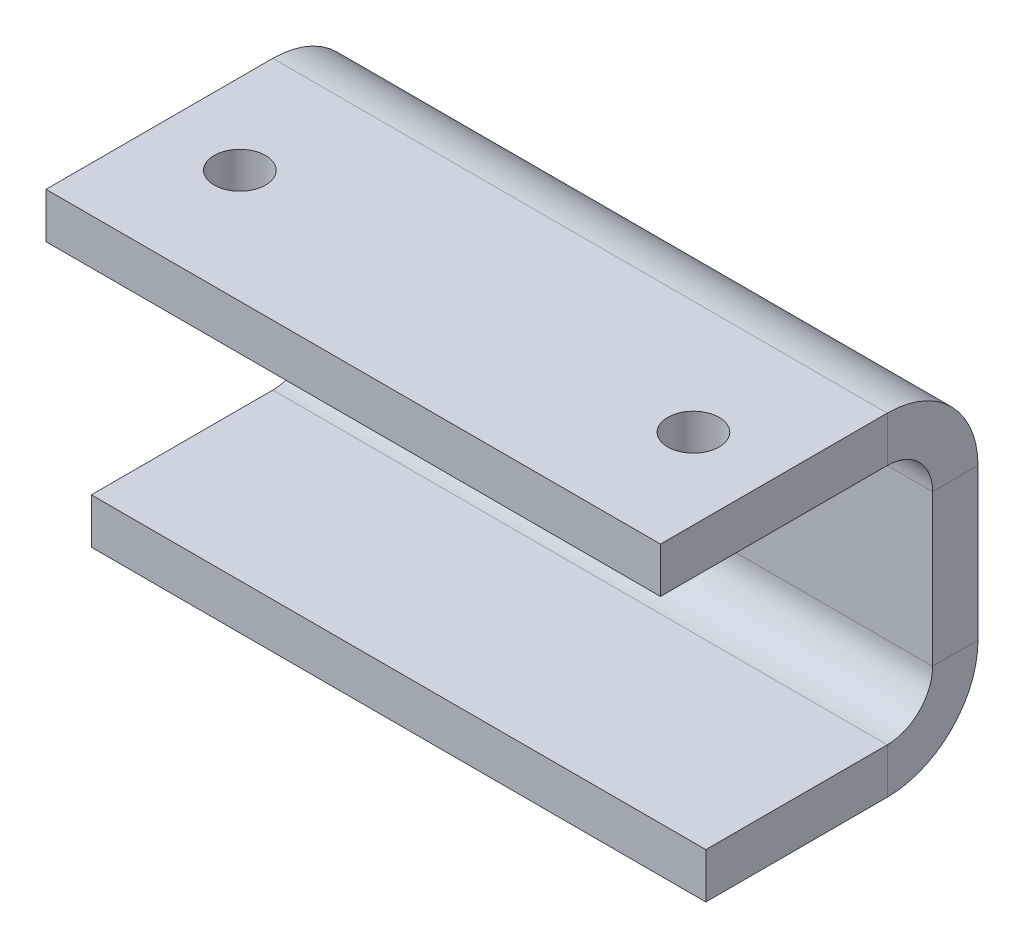
ISO-10303-21;
HEADER;
FILE_DESCRIPTION(('STEP AP214'),'2;1');
FILE_NAME('part.step','',(''),(''),'','','');
FILE_SCHEMA(('AUTOMOTIVE_DESIGN { 1 0 10303 214 1 1 1 1 }'));
ENDSEC;
DATA;
#1=APPLICATION_CONTEXT('core data for automotive mechanical design processes');
#2=APPLICATION_PROTOCOL_DEFINITION('international standard','automotive_design',2000,#1);
#3=PRODUCT_CONTEXT('',#1,'mechanical');
#4=PRODUCT('Part','Part','',(#3));
#5=PRODUCT_RELATED_PRODUCT_CATEGORY('part','',(#4));
#6=PRODUCT_DEFINITION_FORMATION('','',#4);
#7=PRODUCT_DEFINITION_CONTEXT('part definition',#1,'design');
#8=PRODUCT_DEFINITION('design','',#6,#7);
#9=PRODUCT_DEFINITION_SHAPE('','',#8);
#10=(LENGTH_UNIT() NAMED_UNIT(*) SI_UNIT(.MILLI.,.METRE.));
#11=(NAMED_UNIT(*) PLANE_ANGLE_UNIT() SI_UNIT($,.RADIAN.));
#12=(NAMED_UNIT(*) SI_UNIT($,.STERADIAN.) SOLID_ANGLE_UNIT());
#13=UNCERTAINTY_MEASURE_WITH_UNIT(LENGTH_MEASURE(1.E-05),#10,'distance_accuracy_value','');
#14=(GEOMETRIC_REPRESENTATION_CONTEXT(3) GLOBAL_UNCERTAINTY_ASSIGNED_CONTEXT((#13)) GLOBAL_UNIT_ASSIGNED_CONTEXT((#10,
#11,#12)) REPRESENTATION_CONTEXT('',''));
#15=CARTESIAN_POINT('',(0.,0.,0.));
#16=DIRECTION('',(0.,0.,1.));
#17=DIRECTION('',(1.,0.,0.));
#18=AXIS2_PLACEMENT_3D('',#15,#16,#17);
#19=CARTESIAN_POINT('',(20.32,-3.,7.5));
#20=DIRECTION('',(1.,0.,0.));
#21=DIRECTION('',(0.,0.,-1.));
#22=AXIS2_PLACEMENT_3D('',#19,#20,#21);
#23=PLANE('',#22);
#24=DIRECTION('',(0.,0.,-1.));
#25=VECTOR('',#24,1.);
#26=CARTESIAN_POINT('',(20.32,0.,7.5));
#27=LINE('',#26,#25);
#28=CARTESIAN_POINT('',(20.32,0.,7.5));
#29=VERTEX_POINT('',#28);
#30=CARTESIAN_POINT('',(20.32,0.,-7.5));
#31=VERTEX_POINT('',#30);
#32=EDGE_CURVE('E131',#29,#31,#27,.T.);
#33=ORIENTED_EDGE('',*,*,#32,.F.);
#34=DIRECTION('',(0.,1.,0.));
#35=VECTOR('',#34,1.);
#36=CARTESIAN_POINT('',(20.32,-3.,7.5));
#37=LINE('',#36,#35);
#38=CARTESIAN_POINT('',(20.32,-3.,7.5));
#39=VERTEX_POINT('',#38);
#40=EDGE_CURVE('E15',#39,#29,#37,.T.);
#41=ORIENTED_EDGE('',*,*,#40,.F.);
#42=DIRECTION('',(0.,0.,-1.));
#43=VECTOR('',#42,1.);
#44=CARTESIAN_POINT('',(20.32,-3.,7.5));
#45=LINE('',#44,#43);
#46=CARTESIAN_POINT('',(20.32,-3.00000000000001,-7.5));
#47=VERTEX_POINT('',#46);
#48=EDGE_CURVE('E140',#39,#47,#45,.T.);
#49=ORIENTED_EDGE('',*,*,#48,.T.);
#50=DIRECTION('',(0.,1.,0.));
#51=VECTOR('',#50,1.);
#52=CARTESIAN_POINT('',(20.32,-3.,-7.5));
#53=LINE('',#52,#51);
#54=EDGE_CURVE('E93',#47,#31,#53,.T.);
#55=ORIENTED_EDGE('',*,*,#54,.T.);
#56=EDGE_LOOP('',(#33,#41,#49,#55));
#57=FACE_BOUND('',#56,.T.);
#58=ADVANCED_FACE('F90',(#57),#23,.T.);
#59=CARTESIAN_POINT('',(-20.32,-3.,7.5));
#60=DIRECTION('',(0.,0.,1.));
#61=DIRECTION('',(1.,0.,0.));
#62=AXIS2_PLACEMENT_3D('',#59,#60,#61);
#63=PLANE('',#62);
#64=DIRECTION('',(1.,0.,0.));
#65=VECTOR('',#64,1.);
#66=CARTESIAN_POINT('',(-20.32,0.,7.5));
#67=LINE('',#66,#65);
#68=CARTESIAN_POINT('',(-20.32,0.,7.5));
#69=VERTEX_POINT('',#68);
#70=EDGE_CURVE('E126',#69,#29,#67,.T.);
#71=ORIENTED_EDGE('',*,*,#70,.F.);
#72=DIRECTION('',(0.,1.,0.));
#73=VECTOR('',#72,1.);
#74=CARTESIAN_POINT('',(-20.32,-3.,7.5));
#75=LINE('',#74,#73);
#76=CARTESIAN_POINT('',(-20.32,-3.,7.5));
#77=VERTEX_POINT('',#76);
#78=EDGE_CURVE('E99',#77,#69,#75,.T.);
#79=ORIENTED_EDGE('',*,*,#78,.F.);
#80=DIRECTION('',(1.,0.,0.));
#81=VECTOR('',#80,1.);
#82=CARTESIAN_POINT('',(-20.32,-3.,7.5));
#83=LINE('',#82,#81);
#84=EDGE_CURVE('E128',#77,#39,#83,.T.);
#85=ORIENTED_EDGE('',*,*,#84,.T.);
#86=ORIENTED_EDGE('',*,*,#40,.T.);
#87=EDGE_LOOP('',(#71,#79,#85,#86));
#88=FACE_BOUND('',#87,.T.);
#89=ADVANCED_FACE('F124',(#88),#63,.T.);
#90=CARTESIAN_POINT('',(-20.32,-3.,7.5));
#91=DIRECTION('',(-1.,0.,0.));
#92=DIRECTION('',(0.,0.,1.));
#93=AXIS2_PLACEMENT_3D('',#90,#91,#92);
#94=PLANE('',#93);
#95=DIRECTION('',(0.,0.,1.));
#96=VECTOR('',#95,1.);
#97=CARTESIAN_POINT('',(-20.32,0.,7.5));
#98=LINE('',#97,#96);
#99=CARTESIAN_POINT('',(-20.32,0.,-7.5));
#100=VERTEX_POINT('',#99);
#101=EDGE_CURVE('E139',#100,#69,#98,.T.);
#102=ORIENTED_EDGE('',*,*,#101,.F.);
#103=DIRECTION('',(0.,1.,0.));
#104=VECTOR('',#103,1.);
#105=CARTESIAN_POINT('',(-20.32,-3.,-7.5));
#106=LINE('',#105,#104);
#107=CARTESIAN_POINT('',(-20.32,-3.00000000000001,-7.5));
#108=VERTEX_POINT('',#107);
#109=EDGE_CURVE('E147',#108,#100,#106,.T.);
#110=ORIENTED_EDGE('',*,*,#109,.F.);
#111=DIRECTION('',(0.,0.,1.));
#112=VECTOR('',#111,1.);
#113=CARTESIAN_POINT('',(-20.32,-3.,7.5));
#114=LINE('',#113,#112);
#115=EDGE_CURVE('E153',#108,#77,#114,.T.);
#116=ORIENTED_EDGE('',*,*,#115,.T.);
#117=ORIENTED_EDGE('',*,*,#78,.T.);
#118=EDGE_LOOP('',(#102,#110,#116,#117));
#119=FACE_BOUND('',#118,.T.);
#120=ADVANCED_FACE('F200',(#119),#94,.T.);
#121=CARTESIAN_POINT('',(0.,-3.,0.));
#122=DIRECTION('',(0.,-1.,0.));
#123=DIRECTION('',(0.,0.,-1.));
#124=AXIS2_PLACEMENT_3D('',#121,#122,#123);
#125=PLANE('',#124);
#126=CARTESIAN_POINT('',(-15.,-3.,0.));
#127=DIRECTION('',(0.,-1.,0.));
#128=DIRECTION('',(0.,0.,-1.));
#129=AXIS2_PLACEMENT_3D('',#126,#127,#128);
#130=CIRCLE('',#129,1.7);
#131=CARTESIAN_POINT('',(-15.,-3.,-1.7));
#132=VERTEX_POINT('',#131);
#133=EDGE_CURVE('E316',#132,#132,#130,.T.);
#134=ORIENTED_EDGE('',*,*,#133,.F.);
#135=EDGE_LOOP('',(#134));
#136=FACE_BOUND('',#135,.T.);
#137=CARTESIAN_POINT('',(15.,-3.,0.));
#138=DIRECTION('',(0.,-1.,0.));
#139=DIRECTION('',(0.,0.,-1.));
#140=AXIS2_PLACEMENT_3D('',#137,#138,#139);
#141=CIRCLE('',#140,1.7);
#142=CARTESIAN_POINT('',(15.,-3.,-1.7));
#143=VERTEX_POINT('',#142);
#144=EDGE_CURVE('E279',#143,#143,#141,.T.);
#145=ORIENTED_EDGE('',*,*,#144,.F.);
#146=EDGE_LOOP('',(#145));
#147=FACE_BOUND('',#146,.T.);
#148=ORIENTED_EDGE('',*,*,#48,.F.);
#149=ORIENTED_EDGE('',*,*,#84,.F.);
#150=ORIENTED_EDGE('',*,*,#115,.F.);
#151=DIRECTION('',(-1.,0.,0.));
#152=VECTOR('',#151,1.);
#153=CARTESIAN_POINT('',(-20.32,-3.,-7.5));
#154=LINE('',#153,#152);
#155=EDGE_CURVE('E142',#47,#108,#154,.T.);
#156=ORIENTED_EDGE('',*,*,#155,.F.);
#157=EDGE_LOOP('',(#148,#149,#150,#156));
#158=FACE_BOUND('',#157,.T.);
#159=ADVANCED_FACE('F201',(#136,#147,#158),#125,.T.);
#160=CARTESIAN_POINT('',(0.,0.,0.));
#161=DIRECTION('',(0.,-1.,0.));
#162=DIRECTION('',(0.,0.,-1.));
#163=AXIS2_PLACEMENT_3D('',#160,#161,#162);
#164=PLANE('',#163);
#165=CARTESIAN_POINT('',(-15.,0.,0.));
#166=DIRECTION('',(0.,1.,0.));
#167=DIRECTION('',(0.,0.,1.));
#168=AXIS2_PLACEMENT_3D('',#165,#166,#167);
#169=CIRCLE('',#168,1.7);
#170=CARTESIAN_POINT('',(-15.,0.,1.7));
#171=VERTEX_POINT('',#170);
#172=EDGE_CURVE('E319',#171,#171,#169,.T.);
#173=ORIENTED_EDGE('',*,*,#172,.F.);
#174=EDGE_LOOP('',(#173));
#175=FACE_BOUND('',#174,.T.);
#176=CARTESIAN_POINT('',(15.,0.,0.));
#177=DIRECTION('',(0.,1.,0.));
#178=DIRECTION('',(0.,0.,1.));
#179=AXIS2_PLACEMENT_3D('',#176,#177,#178);
#180=CIRCLE('',#179,1.7);
#181=CARTESIAN_POINT('',(15.,0.,1.7));
#182=VERTEX_POINT('',#181);
#183=EDGE_CURVE('E313',#182,#182,#180,.T.);
#184=ORIENTED_EDGE('',*,*,#183,.F.);
#185=EDGE_LOOP('',(#184));
#186=FACE_BOUND('',#185,.T.);
#187=ORIENTED_EDGE('',*,*,#32,.T.);
#188=DIRECTION('',(-1.,0.,0.));
#189=VECTOR('',#188,1.);
#190=CARTESIAN_POINT('',(-20.32,0.,-7.5));
#191=LINE('',#190,#189);
#192=EDGE_CURVE('E135',#31,#100,#191,.T.);
#193=ORIENTED_EDGE('',*,*,#192,.T.);
#194=ORIENTED_EDGE('',*,*,#101,.T.);
#195=ORIENTED_EDGE('',*,*,#70,.T.);
#196=EDGE_LOOP('',(#187,#193,#194,#195));
#197=FACE_BOUND('',#196,.T.);
#198=ADVANCED_FACE('F138',(#175,#186,#197),#164,.F.);
#199=CARTESIAN_POINT('',(-20.32,-6.00000000000001,-7.5));
#200=DIRECTION('',(-1.,0.,0.));
#201=DIRECTION('',(0.,0.,1.));
#202=AXIS2_PLACEMENT_3D('',#199,#200,#201);
#203=PLANE('',#202);
#204=DIRECTION('',(0.,0.,-1.));
#205=VECTOR('',#204,1.);
#206=CARTESIAN_POINT('',(-20.32,-5.99999999999997,-13.5));
#207=LINE('',#206,#205);
#208=CARTESIAN_POINT('',(-20.32,-6.,-10.5));
#209=VERTEX_POINT('',#208);
#210=CARTESIAN_POINT('',(-20.32,-5.99999999999999,-13.5));
#211=VERTEX_POINT('',#210);
#212=EDGE_CURVE('E199',#209,#211,#207,.T.);
#213=ORIENTED_EDGE('',*,*,#212,.F.);
#214=CARTESIAN_POINT('',(-20.32,-6.00000000000001,-7.5));
#215=DIRECTION('',(1.,0.,0.));
#216=DIRECTION('',(0.,0.,-1.));
#217=AXIS2_PLACEMENT_3D('',#214,#215,#216);
#218=CIRCLE('',#217,3.);
#219=EDGE_CURVE('E176',#108,#209,#218,.F.);
#220=ORIENTED_EDGE('',*,*,#219,.F.);
#221=ORIENTED_EDGE('',*,*,#109,.T.);
#222=CARTESIAN_POINT('',(-20.32,-6.00000000000001,-7.5));
#223=DIRECTION('',(1.,0.,0.));
#224=DIRECTION('',(0.,0.,-1.));
#225=AXIS2_PLACEMENT_3D('',#222,#223,#224);
#226=CIRCLE('',#225,6.);
#227=EDGE_CURVE('E136',#100,#211,#226,.F.);
#228=ORIENTED_EDGE('',*,*,#227,.T.);
#229=EDGE_LOOP('',(#213,#220,#221,#228));
#230=FACE_BOUND('',#229,.T.);
#231=ADVANCED_FACE('F197',(#230),#203,.T.);
#232=CARTESIAN_POINT('',(20.32,-6.00000000000001,-7.5));
#233=DIRECTION('',(-1.,0.,0.));
#234=DIRECTION('',(0.,0.,1.));
#235=AXIS2_PLACEMENT_3D('',#232,#233,#234);
#236=PLANE('',#235);
#237=CARTESIAN_POINT('',(20.32,-6.00000000000001,-7.5));
#238=DIRECTION('',(1.,0.,0.));
#239=DIRECTION('',(0.,0.,-1.));
#240=AXIS2_PLACEMENT_3D('',#237,#238,#239);
#241=CIRCLE('',#240,3.);
#242=CARTESIAN_POINT('',(20.32,-6.,-10.5));
#243=VERTEX_POINT('',#242);
#244=EDGE_CURVE('E180',#243,#47,#241,.T.);
#245=ORIENTED_EDGE('',*,*,#244,.F.);
#246=DIRECTION('',(0.,0.,-1.));
#247=VECTOR('',#246,1.);
#248=CARTESIAN_POINT('',(20.32,-5.99999999999999,-10.5));
#249=LINE('',#248,#247);
#250=CARTESIAN_POINT('',(20.32,-5.99999999999997,-13.5));
#251=VERTEX_POINT('',#250);
#252=EDGE_CURVE('E174',#243,#251,#249,.T.);
#253=ORIENTED_EDGE('',*,*,#252,.T.);
#254=CARTESIAN_POINT('',(20.32,-6.00000000000001,-7.5));
#255=DIRECTION('',(1.,0.,0.));
#256=DIRECTION('',(0.,0.,-1.));
#257=AXIS2_PLACEMENT_3D('',#254,#255,#256);
#258=CIRCLE('',#257,6.);
#259=EDGE_CURVE('E164',#251,#31,#258,.T.);
#260=ORIENTED_EDGE('',*,*,#259,.T.);
#261=ORIENTED_EDGE('',*,*,#54,.F.);
#262=EDGE_LOOP('',(#245,#253,#260,#261));
#263=FACE_BOUND('',#262,.T.);
#264=ADVANCED_FACE('F170',(#263),#236,.F.);
#265=CARTESIAN_POINT('',(20.32,-6.00000000000001,-7.5));
#266=DIRECTION('',(1.,0.,0.));
#267=DIRECTION('',(0.,0.,-1.));
#268=AXIS2_PLACEMENT_3D('',#265,#266,#267);
#269=CYLINDRICAL_SURFACE('',#268,6.);
#270=ORIENTED_EDGE('',*,*,#192,.F.);
#271=ORIENTED_EDGE('',*,*,#259,.F.);
#272=DIRECTION('',(1.,0.,0.));
#273=VECTOR('',#272,1.);
#274=CARTESIAN_POINT('',(0.,-5.99999999999997,-13.5));
#275=LINE('',#274,#273);
#276=EDGE_CURVE('E220',#211,#251,#275,.T.);
#277=ORIENTED_EDGE('',*,*,#276,.F.);
#278=ORIENTED_EDGE('',*,*,#227,.F.);
#279=EDGE_LOOP('',(#270,#271,#277,#278));
#280=FACE_BOUND('',#279,.T.);
#281=ADVANCED_FACE('F161',(#280),#269,.T.);
#282=CARTESIAN_POINT('',(20.32,-6.00000000000001,-7.5));
#283=DIRECTION('',(1.,0.,0.));
#284=DIRECTION('',(0.,0.,-1.));
#285=AXIS2_PLACEMENT_3D('',#282,#283,#284);
#286=CYLINDRICAL_SURFACE('',#285,3.);
#287=ORIENTED_EDGE('',*,*,#155,.T.);
#288=ORIENTED_EDGE('',*,*,#219,.T.);
#289=DIRECTION('',(-1.,0.,0.));
#290=VECTOR('',#289,1.);
#291=CARTESIAN_POINT('',(-20.32,-5.99999999999999,-10.5));
#292=LINE('',#291,#290);
#293=EDGE_CURVE('E233',#209,#243,#292,.F.);
#294=ORIENTED_EDGE('',*,*,#293,.T.);
#295=ORIENTED_EDGE('',*,*,#244,.T.);
#296=EDGE_LOOP('',(#287,#288,#294,#295));
#297=FACE_BOUND('',#296,.T.);
#298=ADVANCED_FACE('F189',(#297),#286,.F.);
#299=CARTESIAN_POINT('',(20.32,-2.99999999999999,-13.5));
#300=DIRECTION('',(1.,0.,0.));
#301=DIRECTION('',(0.,0.,-1.));
#302=AXIS2_PLACEMENT_3D('',#299,#300,#301);
#303=PLANE('',#302);
#304=DIRECTION('',(0.,1.,0.));
#305=VECTOR('',#304,1.);
#306=CARTESIAN_POINT('',(20.32,-2.99999999999999,-13.5));
#307=LINE('',#306,#305);
#308=CARTESIAN_POINT('',(20.32,-16.,-13.5));
#309=VERTEX_POINT('',#308);
#310=EDGE_CURVE('E241',#309,#251,#307,.T.);
#311=ORIENTED_EDGE('',*,*,#310,.T.);
#312=ORIENTED_EDGE('',*,*,#252,.F.);
#313=DIRECTION('',(0.,-1.,0.));
#314=VECTOR('',#313,1.);
#315=CARTESIAN_POINT('',(20.32,0.,-10.5));
#316=LINE('',#315,#314);
#317=CARTESIAN_POINT('',(20.32,-16.,-10.5));
#318=VERTEX_POINT('',#317);
#319=EDGE_CURVE('E239',#318,#243,#316,.F.);
#320=ORIENTED_EDGE('',*,*,#319,.F.);
#321=DIRECTION('',(0.,0.,1.));
#322=VECTOR('',#321,1.);
#323=CARTESIAN_POINT('',(20.32,-16.,-13.5));
#324=LINE('',#323,#322);
#325=EDGE_CURVE('E184',#309,#318,#324,.T.);
#326=ORIENTED_EDGE('',*,*,#325,.F.);
#327=EDGE_LOOP('',(#311,#312,#320,#326));
#328=FACE_BOUND('',#327,.T.);
#329=ADVANCED_FACE('F258',(#328),#303,.T.);
#330=CARTESIAN_POINT('',(-20.32,-16.,-13.5));
#331=DIRECTION('',(-1.,0.,0.));
#332=DIRECTION('',(0.,0.,1.));
#333=AXIS2_PLACEMENT_3D('',#330,#331,#332);
#334=PLANE('',#333);
#335=DIRECTION('',(0.,1.,0.));
#336=VECTOR('',#335,1.);
#337=CARTESIAN_POINT('',(-20.32,0.,-10.5));
#338=LINE('',#337,#336);
#339=CARTESIAN_POINT('',(-20.32,-16.,-10.5));
#340=VERTEX_POINT('',#339);
#341=EDGE_CURVE('E225',#209,#340,#338,.F.);
#342=ORIENTED_EDGE('',*,*,#341,.F.);
#343=ORIENTED_EDGE('',*,*,#212,.T.);
#344=DIRECTION('',(0.,-1.,0.));
#345=VECTOR('',#344,1.);
#346=CARTESIAN_POINT('',(-20.32,-16.,-13.5));
#347=LINE('',#346,#345);
#348=CARTESIAN_POINT('',(-20.32,-16.,-13.5));
#349=VERTEX_POINT('',#348);
#350=EDGE_CURVE('E231',#211,#349,#347,.T.);
#351=ORIENTED_EDGE('',*,*,#350,.T.);
#352=DIRECTION('',(0.,0.,1.));
#353=VECTOR('',#352,1.);
#354=CARTESIAN_POINT('',(-20.32,-16.,-13.5));
#355=LINE('',#354,#353);
#356=EDGE_CURVE('E259',#349,#340,#355,.T.);
#357=ORIENTED_EDGE('',*,*,#356,.T.);
#358=EDGE_LOOP('',(#342,#343,#351,#357));
#359=FACE_BOUND('',#358,.T.);
#360=ADVANCED_FACE('F229',(#359),#334,.T.);
#361=CARTESIAN_POINT('',(0.,0.,-13.5));
#362=DIRECTION('',(0.,0.,-1.));
#363=DIRECTION('',(0.,1.,0.));
#364=AXIS2_PLACEMENT_3D('',#361,#362,#363);
#365=PLANE('',#364);
#366=ORIENTED_EDGE('',*,*,#350,.F.);
#367=ORIENTED_EDGE('',*,*,#276,.T.);
#368=ORIENTED_EDGE('',*,*,#310,.F.);
#369=DIRECTION('',(1.,0.,0.));
#370=VECTOR('',#369,1.);
#371=CARTESIAN_POINT('',(20.32,-16.,-13.5));
#372=LINE('',#371,#370);
#373=EDGE_CURVE('E237',#349,#309,#372,.T.);
#374=ORIENTED_EDGE('',*,*,#373,.F.);
#375=EDGE_LOOP('',(#366,#367,#368,#374));
#376=FACE_BOUND('',#375,.T.);
#377=ADVANCED_FACE('F235',(#376),#365,.T.);
#378=CARTESIAN_POINT('',(0.,0.,-10.5));
#379=DIRECTION('',(0.,0.,-1.));
#380=DIRECTION('',(0.,1.,0.));
#381=AXIS2_PLACEMENT_3D('',#378,#379,#380);
#382=PLANE('',#381);
#383=ORIENTED_EDGE('',*,*,#293,.F.);
#384=ORIENTED_EDGE('',*,*,#341,.T.);
#385=DIRECTION('',(-1.,0.,0.));
#386=VECTOR('',#385,1.);
#387=CARTESIAN_POINT('',(0.,-16.,-10.5));
#388=LINE('',#387,#386);
#389=EDGE_CURVE('E244',#340,#318,#388,.F.);
#390=ORIENTED_EDGE('',*,*,#389,.T.);
#391=ORIENTED_EDGE('',*,*,#319,.T.);
#392=EDGE_LOOP('',(#383,#384,#390,#391));
#393=FACE_BOUND('',#392,.T.);
#394=ADVANCED_FACE('F253',(#393),#382,.F.);
#395=CARTESIAN_POINT('',(-20.32,-16.,-7.50000000000004));
#396=DIRECTION('',(-1.,0.,0.));
#397=DIRECTION('',(0.,0.,1.));
#398=AXIS2_PLACEMENT_3D('',#395,#396,#397);
#399=PLANE('',#398);
#400=DIRECTION('',(0.,1.,0.));
#401=VECTOR('',#400,1.);
#402=CARTESIAN_POINT('',(-20.32,-22.,-7.50000000000008));
#403=LINE('',#402,#401);
#404=CARTESIAN_POINT('',(-20.32,-19.,-7.50000000000006));
#405=VERTEX_POINT('',#404);
#406=CARTESIAN_POINT('',(-20.32,-22.,-7.50000000000008));
#407=VERTEX_POINT('',#406);
#408=EDGE_CURVE('E275',#405,#407,#403,.F.);
#409=ORIENTED_EDGE('',*,*,#408,.F.);
#410=CARTESIAN_POINT('',(-20.32,-16.,-7.50000000000004));
#411=DIRECTION('',(1.,0.,0.));
#412=DIRECTION('',(0.,0.,-1.));
#413=AXIS2_PLACEMENT_3D('',#410,#411,#412);
#414=CIRCLE('',#413,3.);
#415=EDGE_CURVE('E266',#340,#405,#414,.F.);
#416=ORIENTED_EDGE('',*,*,#415,.F.);
#417=ORIENTED_EDGE('',*,*,#356,.F.);
#418=CARTESIAN_POINT('',(-20.32,-16.,-7.50000000000004));
#419=DIRECTION('',(1.,0.,0.));
#420=DIRECTION('',(0.,0.,-1.));
#421=AXIS2_PLACEMENT_3D('',#418,#419,#420);
#422=CIRCLE('',#421,6.);
#423=EDGE_CURVE('E234',#349,#407,#422,.F.);
#424=ORIENTED_EDGE('',*,*,#423,.T.);
#425=EDGE_LOOP('',(#409,#416,#417,#424));
#426=FACE_BOUND('',#425,.T.);
#427=ADVANCED_FACE('F433',(#426),#399,.T.);
#428=CARTESIAN_POINT('',(20.32,-16.,-7.50000000000004));
#429=DIRECTION('',(-1.,0.,0.));
#430=DIRECTION('',(0.,0.,1.));
#431=AXIS2_PLACEMENT_3D('',#428,#429,#430);
#432=PLANE('',#431);
#433=CARTESIAN_POINT('',(20.32,-16.,-7.50000000000004));
#434=DIRECTION('',(1.,0.,0.));
#435=DIRECTION('',(0.,0.,-1.));
#436=AXIS2_PLACEMENT_3D('',#433,#434,#435);
#437=CIRCLE('',#436,3.);
#438=CARTESIAN_POINT('',(20.32,-19.,-7.50000000000006));
#439=VERTEX_POINT('',#438);
#440=EDGE_CURVE('E263',#439,#318,#437,.T.);
#441=ORIENTED_EDGE('',*,*,#440,.F.);
#442=DIRECTION('',(0.,1.,0.));
#443=VECTOR('',#442,1.);
#444=CARTESIAN_POINT('',(20.32,-19.,-7.50000000000006));
#445=LINE('',#444,#443);
#446=CARTESIAN_POINT('',(20.32,-22.,-7.50000000000008));
#447=VERTEX_POINT('',#446);
#448=EDGE_CURVE('E282',#439,#447,#445,.F.);
#449=ORIENTED_EDGE('',*,*,#448,.T.);
#450=CARTESIAN_POINT('',(20.32,-16.,-7.50000000000004));
#451=DIRECTION('',(1.,0.,0.));
#452=DIRECTION('',(0.,0.,-1.));
#453=AXIS2_PLACEMENT_3D('',#450,#451,#452);
#454=CIRCLE('',#453,6.);
#455=EDGE_CURVE('E270',#447,#309,#454,.T.);
#456=ORIENTED_EDGE('',*,*,#455,.T.);
#457=ORIENTED_EDGE('',*,*,#325,.T.);
#458=EDGE_LOOP('',(#441,#449,#456,#457));
#459=FACE_BOUND('',#458,.T.);
#460=ADVANCED_FACE('F443',(#459),#432,.F.);
#461=CARTESIAN_POINT('',(20.32,-16.,-7.50000000000004));
#462=DIRECTION('',(1.,0.,0.));
#463=DIRECTION('',(0.,-1.,0.));
#464=AXIS2_PLACEMENT_3D('',#461,#462,#463);
#465=CYLINDRICAL_SURFACE('',#464,6.);
#466=ORIENTED_EDGE('',*,*,#373,.T.);
#467=ORIENTED_EDGE('',*,*,#455,.F.);
#468=DIRECTION('',(1.,0.,0.));
#469=VECTOR('',#468,1.);
#470=CARTESIAN_POINT('',(-20.32,-22.,-7.50000000000008));
#471=LINE('',#470,#469);
#472=EDGE_CURVE('E285',#447,#407,#471,.F.);
#473=ORIENTED_EDGE('',*,*,#472,.T.);
#474=ORIENTED_EDGE('',*,*,#423,.F.);
#475=EDGE_LOOP('',(#466,#467,#473,#474));
#476=FACE_BOUND('',#475,.T.);
#477=ADVANCED_FACE('F454',(#476),#465,.T.);
#478=CARTESIAN_POINT('',(20.32,-16.,-7.50000000000004));
#479=DIRECTION('',(1.,0.,0.));
#480=DIRECTION('',(0.,-1.,0.));
#481=AXIS2_PLACEMENT_3D('',#478,#479,#480);
#482=CYLINDRICAL_SURFACE('',#481,3.);
#483=ORIENTED_EDGE('',*,*,#389,.F.);
#484=ORIENTED_EDGE('',*,*,#415,.T.);
#485=DIRECTION('',(1.,0.,0.));
#486=VECTOR('',#485,1.);
#487=CARTESIAN_POINT('',(-20.32,-19.,-7.50000000000006));
#488=LINE('',#487,#486);
#489=EDGE_CURVE('E278',#405,#439,#488,.T.);
#490=ORIENTED_EDGE('',*,*,#489,.T.);
#491=ORIENTED_EDGE('',*,*,#440,.T.);
#492=EDGE_LOOP('',(#483,#484,#490,#491));
#493=FACE_BOUND('',#492,.T.);
#494=ADVANCED_FACE('F465',(#493),#482,.F.);
#495=CARTESIAN_POINT('',(20.32,-22.0000000000001,4.49999999999993));
#496=DIRECTION('',(-1.,0.,0.));
#497=DIRECTION('',(0.,0.,1.));
#498=AXIS2_PLACEMENT_3D('',#495,#496,#497);
#499=PLANE('',#498);
#500=ORIENTED_EDGE('',*,*,#448,.F.);
#501=DIRECTION('',(0.,0.,-1.));
#502=VECTOR('',#501,1.);
#503=CARTESIAN_POINT('',(20.32,-19.0000000000001,4.49999999999996));
#504=LINE('',#503,#502);
#505=CARTESIAN_POINT('',(20.32,-19.0000000000001,4.49999999999996));
#506=VERTEX_POINT('',#505);
#507=EDGE_CURVE('E288',#439,#506,#504,.F.);
#508=ORIENTED_EDGE('',*,*,#507,.T.);
#509=DIRECTION('',(0.,1.,0.));
#510=VECTOR('',#509,1.);
#511=CARTESIAN_POINT('',(20.32,-22.0000000000001,4.49999999999993));
#512=LINE('',#511,#510);
#513=CARTESIAN_POINT('',(20.32,-22.0000000000001,4.49999999999993));
#514=VERTEX_POINT('',#513);
#515=EDGE_CURVE('E267',#514,#506,#512,.T.);
#516=ORIENTED_EDGE('',*,*,#515,.F.);
#517=DIRECTION('',(0.,0.,1.));
#518=VECTOR('',#517,1.);
#519=CARTESIAN_POINT('',(20.32,-22.0000000000001,-1.37613484053187E-13));
#520=LINE('',#519,#518);
#521=EDGE_CURVE('E297',#447,#514,#520,.T.);
#522=ORIENTED_EDGE('',*,*,#521,.F.);
#523=EDGE_LOOP('',(#500,#508,#516,#522));
#524=FACE_BOUND('',#523,.T.);
#525=ADVANCED_FACE('F476',(#524),#499,.F.);
#526=CARTESIAN_POINT('',(-20.32,-22.,-10.5000000000001));
#527=DIRECTION('',(1.,0.,0.));
#528=DIRECTION('',(0.,0.,-1.));
#529=AXIS2_PLACEMENT_3D('',#526,#527,#528);
#530=PLANE('',#529);
#531=ORIENTED_EDGE('',*,*,#408,.T.);
#532=DIRECTION('',(0.,0.,-1.));
#533=VECTOR('',#532,1.);
#534=CARTESIAN_POINT('',(-20.32,-22.0000000000001,-1.42313428190767E-13));
#535=LINE('',#534,#533);
#536=CARTESIAN_POINT('',(-20.32,-22.0000000000001,4.49999999999993));
#537=VERTEX_POINT('',#536);
#538=EDGE_CURVE('E303',#537,#407,#535,.T.);
#539=ORIENTED_EDGE('',*,*,#538,.F.);
#540=DIRECTION('',(0.,1.,0.));
#541=VECTOR('',#540,1.);
#542=CARTESIAN_POINT('',(-20.32,-22.0000000000001,4.49999999999993));
#543=LINE('',#542,#541);
#544=CARTESIAN_POINT('',(-20.32,-19.0000000000001,4.49999999999996));
#545=VERTEX_POINT('',#544);
#546=EDGE_CURVE('E306',#537,#545,#543,.T.);
#547=ORIENTED_EDGE('',*,*,#546,.T.);
#548=DIRECTION('',(0.,0.,1.));
#549=VECTOR('',#548,1.);
#550=CARTESIAN_POINT('',(-20.32,-19.,-10.5));
#551=LINE('',#550,#549);
#552=EDGE_CURVE('E294',#545,#405,#551,.F.);
#553=ORIENTED_EDGE('',*,*,#552,.T.);
#554=EDGE_LOOP('',(#531,#539,#547,#553));
#555=FACE_BOUND('',#554,.T.);
#556=ADVANCED_FACE('F487',(#555),#530,.F.);
#557=CARTESIAN_POINT('',(0.,-22.0000000000001,-1.42313428190767E-13));
#558=DIRECTION('',(0.,1.,0.));
#559=DIRECTION('',(0.,0.,1.));
#560=AXIS2_PLACEMENT_3D('',#557,#558,#559);
#561=PLANE('',#560);
#562=ORIENTED_EDGE('',*,*,#472,.F.);
#563=ORIENTED_EDGE('',*,*,#521,.T.);
#564=DIRECTION('',(-1.,0.,0.));
#565=VECTOR('',#564,1.);
#566=CARTESIAN_POINT('',(0.,-22.0000000000001,4.49999999999993));
#567=LINE('',#566,#565);
#568=EDGE_CURVE('E300',#514,#537,#567,.T.);
#569=ORIENTED_EDGE('',*,*,#568,.T.);
#570=ORIENTED_EDGE('',*,*,#538,.T.);
#571=EDGE_LOOP('',(#562,#563,#569,#570));
#572=FACE_BOUND('',#571,.T.);
#573=ADVANCED_FACE('F498',(#572),#561,.F.);
#574=CARTESIAN_POINT('',(0.,-19.0000000000001,-1.21430643318377E-13));
#575=DIRECTION('',(0.,1.,0.));
#576=DIRECTION('',(0.,0.,1.));
#577=AXIS2_PLACEMENT_3D('',#574,#575,#576);
#578=PLANE('',#577);
#579=ORIENTED_EDGE('',*,*,#507,.F.);
#580=ORIENTED_EDGE('',*,*,#489,.F.);
#581=ORIENTED_EDGE('',*,*,#552,.F.);
#582=DIRECTION('',(1.,0.,0.));
#583=VECTOR('',#582,1.);
#584=CARTESIAN_POINT('',(-20.32,-19.0000000000001,4.49999999999996));
#585=LINE('',#584,#583);
#586=EDGE_CURVE('E291',#506,#545,#585,.F.);
#587=ORIENTED_EDGE('',*,*,#586,.F.);
#588=EDGE_LOOP('',(#579,#580,#581,#587));
#589=FACE_BOUND('',#588,.T.);
#590=ADVANCED_FACE('F509',(#589),#578,.T.);
#591=CARTESIAN_POINT('',(-20.32,-22.0000000000001,4.49999999999993));
#592=DIRECTION('',(0.,0.,-1.));
#593=DIRECTION('',(0.,1.,0.));
#594=AXIS2_PLACEMENT_3D('',#591,#592,#593);
#595=PLANE('',#594);
#596=ORIENTED_EDGE('',*,*,#586,.T.);
#597=ORIENTED_EDGE('',*,*,#546,.F.);
#598=ORIENTED_EDGE('',*,*,#568,.F.);
#599=ORIENTED_EDGE('',*,*,#515,.T.);
#600=EDGE_LOOP('',(#596,#597,#598,#599));
#601=FACE_BOUND('',#600,.T.);
#602=ADVANCED_FACE('F334',(#601),#595,.F.);
#603=CARTESIAN_POINT('',(15.,0.,0.));
#604=DIRECTION('',(0.,1.,0.));
#605=DIRECTION('',(0.,0.,1.));
#606=AXIS2_PLACEMENT_3D('',#603,#604,#605);
#607=CYLINDRICAL_SURFACE('',#606,1.7);
#608=ORIENTED_EDGE('',*,*,#183,.T.);
#609=EDGE_LOOP('',(#608));
#610=FACE_BOUND('',#609,.T.);
#611=ORIENTED_EDGE('',*,*,#144,.T.);
#612=EDGE_LOOP('',(#611));
#613=FACE_BOUND('',#612,.T.);
#614=ADVANCED_FACE('F331',(#610,#613),#607,.F.);
#615=CARTESIAN_POINT('',(-15.,0.,0.));
#616=DIRECTION('',(0.,1.,0.));
#617=DIRECTION('',(0.,0.,1.));
#618=AXIS2_PLACEMENT_3D('',#615,#616,#617);
#619=CYLINDRICAL_SURFACE('',#618,1.7);
#620=ORIENTED_EDGE('',*,*,#172,.T.);
#621=EDGE_LOOP('',(#620));
#622=FACE_BOUND('',#621,.T.);
#623=ORIENTED_EDGE('',*,*,#133,.T.);
#624=EDGE_LOOP('',(#623));
#625=FACE_BOUND('',#624,.T.);
#626=ADVANCED_FACE('F323',(#622,#625),#619,.F.);
#627=CLOSED_SHELL('',(#58,#89,#120,#159,#198,#231,#264,#281,#298,#329,#360,#377,#394,#427,#460,
#477,#494,#525,#556,#573,#590,#602,#614,#626));
#628=MANIFOLD_SOLID_BREP('B2',#627);
#629=ADVANCED_BREP_SHAPE_REPRESENTATION('',(#18,#628),#14);
#630=SHAPE_DEFINITION_REPRESENTATION(#9,#629);
ENDSEC;
END-ISO-10303-21;
